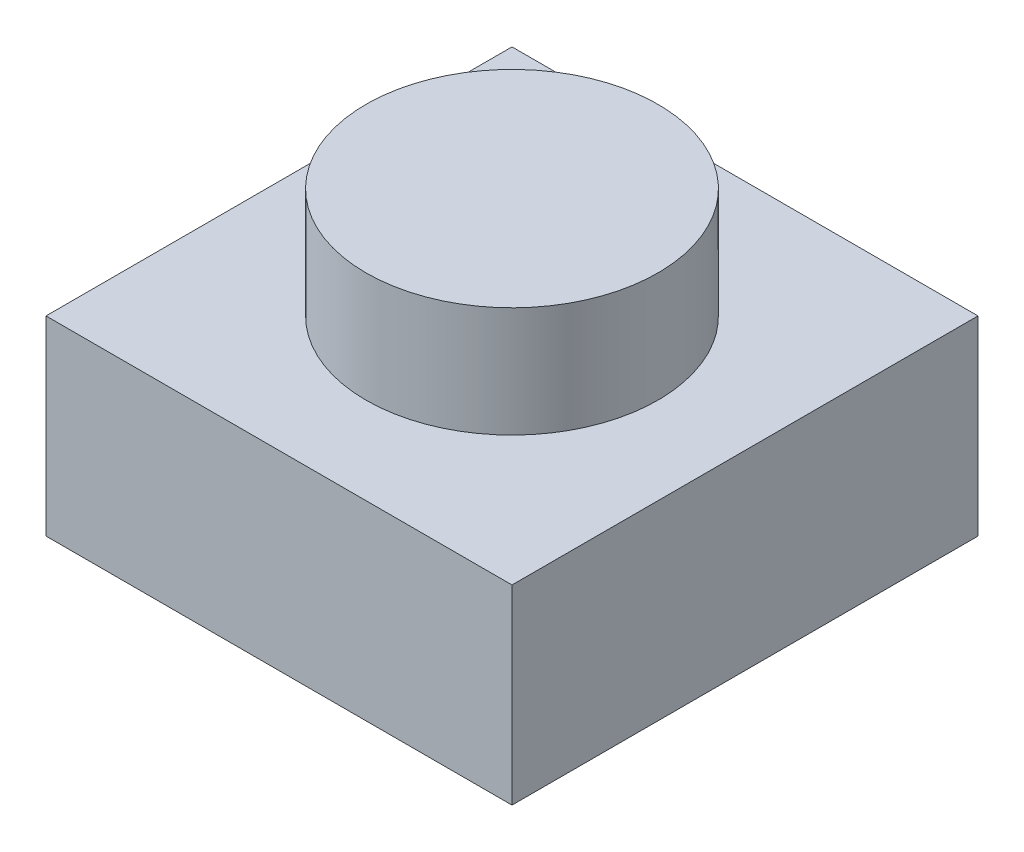
ISO-10303-21;
HEADER;
FILE_DESCRIPTION(('STEP AP214'),'2;1');
FILE_NAME('part.step','',(''),(''),'','','');
FILE_SCHEMA(('AUTOMOTIVE_DESIGN { 1 0 10303 214 1 1 1 1 }'));
ENDSEC;
DATA;
#1=APPLICATION_CONTEXT('core data for automotive mechanical design processes');
#2=APPLICATION_PROTOCOL_DEFINITION('international standard','automotive_design',2000,#1);
#3=PRODUCT_CONTEXT('',#1,'mechanical');
#4=PRODUCT('Part','Part','',(#3));
#5=PRODUCT_RELATED_PRODUCT_CATEGORY('part','',(#4));
#6=PRODUCT_DEFINITION_FORMATION('','',#4);
#7=PRODUCT_DEFINITION_CONTEXT('part definition',#1,'design');
#8=PRODUCT_DEFINITION('design','',#6,#7);
#9=PRODUCT_DEFINITION_SHAPE('','',#8);
#10=(LENGTH_UNIT() NAMED_UNIT(*) SI_UNIT(.MILLI.,.METRE.));
#11=(NAMED_UNIT(*) PLANE_ANGLE_UNIT() SI_UNIT($,.RADIAN.));
#12=(NAMED_UNIT(*) SI_UNIT($,.STERADIAN.) SOLID_ANGLE_UNIT());
#13=UNCERTAINTY_MEASURE_WITH_UNIT(LENGTH_MEASURE(1.E-05),#10,'distance_accuracy_value','');
#14=(GEOMETRIC_REPRESENTATION_CONTEXT(3) GLOBAL_UNCERTAINTY_ASSIGNED_CONTEXT((#13)) GLOBAL_UNIT_ASSIGNED_CONTEXT((#10,
#11,#12)) REPRESENTATION_CONTEXT('',''));
#15=CARTESIAN_POINT('',(0.,0.,0.));
#16=DIRECTION('',(0.,0.,1.));
#17=DIRECTION('',(1.,0.,0.));
#18=AXIS2_PLACEMENT_3D('',#15,#16,#17);
#19=CARTESIAN_POINT('',(3.91,-3.2,-3.91));
#20=DIRECTION('',(1.,0.,0.));
#21=DIRECTION('',(0.,0.,-1.));
#22=AXIS2_PLACEMENT_3D('',#19,#20,#21);
#23=PLANE('',#22);
#24=DIRECTION('',(0.,0.,-1.));
#25=VECTOR('',#24,1.);
#26=CARTESIAN_POINT('',(3.91,0.,-3.91));
#27=LINE('',#26,#25);
#28=CARTESIAN_POINT('',(3.91,0.,3.91));
#29=VERTEX_POINT('',#28);
#30=CARTESIAN_POINT('',(3.91,0.,-3.91));
#31=VERTEX_POINT('',#30);
#32=EDGE_CURVE('E160',#29,#31,#27,.T.);
#33=ORIENTED_EDGE('',*,*,#32,.F.);
#34=DIRECTION('',(0.,1.,0.));
#35=VECTOR('',#34,1.);
#36=CARTESIAN_POINT('',(3.91,-3.2,3.91));
#37=LINE('',#36,#35);
#38=CARTESIAN_POINT('',(3.91,-3.2,3.91));
#39=VERTEX_POINT('',#38);
#40=EDGE_CURVE('E47',#39,#29,#37,.T.);
#41=ORIENTED_EDGE('',*,*,#40,.F.);
#42=DIRECTION('',(0.,0.,-1.));
#43=VECTOR('',#42,1.);
#44=CARTESIAN_POINT('',(3.91,-3.2,-3.91));
#45=LINE('',#44,#43);
#46=CARTESIAN_POINT('',(3.91,-3.2,-3.91));
#47=VERTEX_POINT('',#46);
#48=EDGE_CURVE('E162',#39,#47,#45,.T.);
#49=ORIENTED_EDGE('',*,*,#48,.T.);
#50=DIRECTION('',(0.,1.,0.));
#51=VECTOR('',#50,1.);
#52=CARTESIAN_POINT('',(3.91,-3.2,-3.91));
#53=LINE('',#52,#51);
#54=EDGE_CURVE('E42',#47,#31,#53,.T.);
#55=ORIENTED_EDGE('',*,*,#54,.T.);
#56=EDGE_LOOP('',(#33,#41,#49,#55));
#57=FACE_BOUND('',#56,.T.);
#58=ADVANCED_FACE('F39',(#57),#23,.T.);
#59=CARTESIAN_POINT('',(-3.91,-3.2,3.91));
#60=DIRECTION('',(0.,0.,1.));
#61=DIRECTION('',(1.,0.,0.));
#62=AXIS2_PLACEMENT_3D('',#59,#60,#61);
#63=PLANE('',#62);
#64=DIRECTION('',(1.,0.,0.));
#65=VECTOR('',#64,1.);
#66=CARTESIAN_POINT('',(-3.91,0.,3.91));
#67=LINE('',#66,#65);
#68=CARTESIAN_POINT('',(-3.91,0.,3.91));
#69=VERTEX_POINT('',#68);
#70=EDGE_CURVE('E165',#69,#29,#67,.T.);
#71=ORIENTED_EDGE('',*,*,#70,.F.);
#72=DIRECTION('',(0.,1.,0.));
#73=VECTOR('',#72,1.);
#74=CARTESIAN_POINT('',(-3.91,-3.2,3.91));
#75=LINE('',#74,#73);
#76=CARTESIAN_POINT('',(-3.91,-3.2,3.91));
#77=VERTEX_POINT('',#76);
#78=EDGE_CURVE('E183',#77,#69,#75,.T.);
#79=ORIENTED_EDGE('',*,*,#78,.F.);
#80=DIRECTION('',(1.,0.,0.));
#81=VECTOR('',#80,1.);
#82=CARTESIAN_POINT('',(-3.91,-3.2,3.91));
#83=LINE('',#82,#81);
#84=EDGE_CURVE('E170',#77,#39,#83,.T.);
#85=ORIENTED_EDGE('',*,*,#84,.T.);
#86=ORIENTED_EDGE('',*,*,#40,.T.);
#87=EDGE_LOOP('',(#71,#79,#85,#86));
#88=FACE_BOUND('',#87,.T.);
#89=ADVANCED_FACE('F189',(#88),#63,.T.);
#90=CARTESIAN_POINT('',(-3.91,-3.2,-3.91));
#91=DIRECTION('',(-1.,0.,0.));
#92=DIRECTION('',(0.,0.,1.));
#93=AXIS2_PLACEMENT_3D('',#90,#91,#92);
#94=PLANE('',#93);
#95=DIRECTION('',(0.,0.,1.));
#96=VECTOR('',#95,1.);
#97=CARTESIAN_POINT('',(-3.91,0.,-3.91));
#98=LINE('',#97,#96);
#99=CARTESIAN_POINT('',(-3.91,0.,-3.91));
#100=VERTEX_POINT('',#99);
#101=EDGE_CURVE('E177',#100,#69,#98,.T.);
#102=ORIENTED_EDGE('',*,*,#101,.F.);
#103=DIRECTION('',(0.,1.,0.));
#104=VECTOR('',#103,1.);
#105=CARTESIAN_POINT('',(-3.91,-3.2,-3.91));
#106=LINE('',#105,#104);
#107=CARTESIAN_POINT('',(-3.91,-3.2,-3.91));
#108=VERTEX_POINT('',#107);
#109=EDGE_CURVE('E184',#108,#100,#106,.T.);
#110=ORIENTED_EDGE('',*,*,#109,.F.);
#111=DIRECTION('',(0.,0.,1.));
#112=VECTOR('',#111,1.);
#113=CARTESIAN_POINT('',(-3.91,-3.2,-3.91));
#114=LINE('',#113,#112);
#115=EDGE_CURVE('E167',#108,#77,#114,.T.);
#116=ORIENTED_EDGE('',*,*,#115,.T.);
#117=ORIENTED_EDGE('',*,*,#78,.T.);
#118=EDGE_LOOP('',(#102,#110,#116,#117));
#119=FACE_BOUND('',#118,.T.);
#120=ADVANCED_FACE('F193',(#119),#94,.T.);
#121=CARTESIAN_POINT('',(-3.91,-3.2,-3.91));
#122=DIRECTION('',(0.,0.,-1.));
#123=DIRECTION('',(-1.,0.,0.));
#124=AXIS2_PLACEMENT_3D('',#121,#122,#123);
#125=PLANE('',#124);
#126=DIRECTION('',(-1.,0.,0.));
#127=VECTOR('',#126,1.);
#128=CARTESIAN_POINT('',(-3.91,0.,-3.91));
#129=LINE('',#128,#127);
#130=EDGE_CURVE('E174',#31,#100,#129,.T.);
#131=ORIENTED_EDGE('',*,*,#130,.F.);
#132=ORIENTED_EDGE('',*,*,#54,.F.);
#133=DIRECTION('',(-1.,0.,0.));
#134=VECTOR('',#133,1.);
#135=CARTESIAN_POINT('',(-3.91,-3.2,-3.91));
#136=LINE('',#135,#134);
#137=EDGE_CURVE('E164',#47,#108,#136,.T.);
#138=ORIENTED_EDGE('',*,*,#137,.T.);
#139=ORIENTED_EDGE('',*,*,#109,.T.);
#140=EDGE_LOOP('',(#131,#132,#138,#139));
#141=FACE_BOUND('',#140,.T.);
#142=ADVANCED_FACE('F186',(#141),#125,.T.);
#143=CARTESIAN_POINT('',(0.,-3.2,0.));
#144=DIRECTION('',(0.,1.,0.));
#145=DIRECTION('',(0.,0.,1.));
#146=AXIS2_PLACEMENT_3D('',#143,#144,#145);
#147=PLANE('',#146);
#148=DIRECTION('',(1.,0.,0.));
#149=VECTOR('',#148,1.);
#150=CARTESIAN_POINT('',(0.,-3.2,2.4));
#151=LINE('',#150,#149);
#152=CARTESIAN_POINT('',(-2.4,-3.2,2.4));
#153=VERTEX_POINT('',#152);
#154=CARTESIAN_POINT('',(2.4,-3.2,2.4));
#155=VERTEX_POINT('',#154);
#156=EDGE_CURVE('E154',#153,#155,#151,.T.);
#157=ORIENTED_EDGE('',*,*,#156,.T.);
#158=DIRECTION('',(0.,0.,-1.));
#159=VECTOR('',#158,1.);
#160=CARTESIAN_POINT('',(2.4,-3.2,0.));
#161=LINE('',#160,#159);
#162=CARTESIAN_POINT('',(2.4,-3.2,-2.4));
#163=VERTEX_POINT('',#162);
#164=EDGE_CURVE('E117',#155,#163,#161,.T.);
#165=ORIENTED_EDGE('',*,*,#164,.T.);
#166=DIRECTION('',(-1.,0.,0.));
#167=VECTOR('',#166,1.);
#168=CARTESIAN_POINT('',(0.,-3.2,-2.4));
#169=LINE('',#168,#167);
#170=CARTESIAN_POINT('',(-2.4,-3.2,-2.4));
#171=VERTEX_POINT('',#170);
#172=EDGE_CURVE('E139',#163,#171,#169,.T.);
#173=ORIENTED_EDGE('',*,*,#172,.T.);
#174=DIRECTION('',(0.,0.,1.));
#175=VECTOR('',#174,1.);
#176=CARTESIAN_POINT('',(-2.4,-3.2,0.));
#177=LINE('',#176,#175);
#178=EDGE_CURVE('E55',#171,#153,#177,.T.);
#179=ORIENTED_EDGE('',*,*,#178,.T.);
#180=EDGE_LOOP('',(#157,#165,#173,#179));
#181=FACE_BOUND('',#180,.T.);
#182=ORIENTED_EDGE('',*,*,#48,.F.);
#183=ORIENTED_EDGE('',*,*,#84,.F.);
#184=ORIENTED_EDGE('',*,*,#115,.F.);
#185=ORIENTED_EDGE('',*,*,#137,.F.);
#186=EDGE_LOOP('',(#182,#183,#184,#185));
#187=FACE_BOUND('',#186,.T.);
#188=ADVANCED_FACE('F195',(#181,#187),#147,.F.);
#189=CARTESIAN_POINT('',(0.,0.,0.));
#190=DIRECTION('',(0.,1.,0.));
#191=DIRECTION('',(0.,0.,1.));
#192=AXIS2_PLACEMENT_3D('',#189,#190,#191);
#193=PLANE('',#192);
#194=CARTESIAN_POINT('',(0.,0.,0.));
#195=DIRECTION('',(0.,1.,0.));
#196=DIRECTION('',(0.,0.,1.));
#197=AXIS2_PLACEMENT_3D('',#194,#195,#196);
#198=CIRCLE('',#197,2.45);
#199=CARTESIAN_POINT('',(0.,0.,2.45));
#200=VERTEX_POINT('',#199);
#201=EDGE_CURVE('E11',#200,#200,#198,.T.);
#202=ORIENTED_EDGE('',*,*,#201,.F.);
#203=EDGE_LOOP('',(#202));
#204=FACE_BOUND('',#203,.T.);
#205=ORIENTED_EDGE('',*,*,#32,.T.);
#206=ORIENTED_EDGE('',*,*,#130,.T.);
#207=ORIENTED_EDGE('',*,*,#101,.T.);
#208=ORIENTED_EDGE('',*,*,#70,.T.);
#209=EDGE_LOOP('',(#205,#206,#207,#208));
#210=FACE_BOUND('',#209,.T.);
#211=ADVANCED_FACE('F188',(#204,#210),#193,.T.);
#212=CARTESIAN_POINT('',(0.,1.85,0.));
#213=DIRECTION('',(0.,-1.,0.));
#214=DIRECTION('',(0.,0.,-1.));
#215=AXIS2_PLACEMENT_3D('',#212,#213,#214);
#216=CYLINDRICAL_SURFACE('',#215,2.45);
#217=CARTESIAN_POINT('',(0.,1.85,0.));
#218=DIRECTION('',(0.,1.,0.));
#219=DIRECTION('',(0.,0.,1.));
#220=AXIS2_PLACEMENT_3D('',#217,#218,#219);
#221=CIRCLE('',#220,2.45);
#222=CARTESIAN_POINT('',(0.,1.85,2.45));
#223=VERTEX_POINT('',#222);
#224=EDGE_CURVE('E151',#223,#223,#221,.T.);
#225=ORIENTED_EDGE('',*,*,#224,.F.);
#226=EDGE_LOOP('',(#225));
#227=FACE_BOUND('',#226,.T.);
#228=ORIENTED_EDGE('',*,*,#201,.T.);
#229=EDGE_LOOP('',(#228));
#230=FACE_BOUND('',#229,.T.);
#231=ADVANCED_FACE('F203',(#227,#230),#216,.T.);
#232=CARTESIAN_POINT('',(0.,1.85,0.));
#233=DIRECTION('',(0.,1.,0.));
#234=DIRECTION('',(0.,0.,1.));
#235=AXIS2_PLACEMENT_3D('',#232,#233,#234);
#236=PLANE('',#235);
#237=ORIENTED_EDGE('',*,*,#224,.T.);
#238=EDGE_LOOP('',(#237));
#239=FACE_BOUND('',#238,.T.);
#240=ADVANCED_FACE('F238',(#239),#236,.T.);
#241=CARTESIAN_POINT('',(2.4,-3.2,-3.91));
#242=DIRECTION('',(1.,0.,0.));
#243=DIRECTION('',(0.,0.,-1.));
#244=AXIS2_PLACEMENT_3D('',#241,#242,#243);
#245=PLANE('',#244);
#246=DIRECTION('',(0.,0.,-1.));
#247=VECTOR('',#246,1.);
#248=CARTESIAN_POINT('',(2.4,-1.51,0.));
#249=LINE('',#248,#247);
#250=CARTESIAN_POINT('',(2.4,-1.51,2.4));
#251=VERTEX_POINT('',#250);
#252=CARTESIAN_POINT('',(2.4,-1.51,-2.4));
#253=VERTEX_POINT('',#252);
#254=EDGE_CURVE('E115',#251,#253,#249,.T.);
#255=ORIENTED_EDGE('',*,*,#254,.T.);
#256=DIRECTION('',(0.,1.,0.));
#257=VECTOR('',#256,1.);
#258=CARTESIAN_POINT('',(2.4,-3.2,-2.4));
#259=LINE('',#258,#257);
#260=EDGE_CURVE('E144',#163,#253,#259,.T.);
#261=ORIENTED_EDGE('',*,*,#260,.F.);
#262=ORIENTED_EDGE('',*,*,#164,.F.);
#263=DIRECTION('',(0.,1.,0.));
#264=VECTOR('',#263,1.);
#265=CARTESIAN_POINT('',(2.4,-3.2,2.4));
#266=LINE('',#265,#264);
#267=EDGE_CURVE('E112',#155,#251,#266,.T.);
#268=ORIENTED_EDGE('',*,*,#267,.T.);
#269=EDGE_LOOP('',(#255,#261,#262,#268));
#270=FACE_BOUND('',#269,.T.);
#271=ADVANCED_FACE('F114',(#270),#245,.F.);
#272=CARTESIAN_POINT('',(-3.91,-3.2,2.4));
#273=DIRECTION('',(0.,0.,1.));
#274=DIRECTION('',(1.,0.,0.));
#275=AXIS2_PLACEMENT_3D('',#272,#273,#274);
#276=PLANE('',#275);
#277=DIRECTION('',(1.,0.,0.));
#278=VECTOR('',#277,1.);
#279=CARTESIAN_POINT('',(0.,-1.51,2.4));
#280=LINE('',#279,#278);
#281=CARTESIAN_POINT('',(-2.4,-1.51,2.4));
#282=VERTEX_POINT('',#281);
#283=EDGE_CURVE('E130',#282,#251,#280,.T.);
#284=ORIENTED_EDGE('',*,*,#283,.T.);
#285=ORIENTED_EDGE('',*,*,#267,.F.);
#286=ORIENTED_EDGE('',*,*,#156,.F.);
#287=DIRECTION('',(0.,1.,0.));
#288=VECTOR('',#287,1.);
#289=CARTESIAN_POINT('',(-2.4,-3.2,2.4));
#290=LINE('',#289,#288);
#291=EDGE_CURVE('E123',#153,#282,#290,.T.);
#292=ORIENTED_EDGE('',*,*,#291,.T.);
#293=EDGE_LOOP('',(#284,#285,#286,#292));
#294=FACE_BOUND('',#293,.T.);
#295=ADVANCED_FACE('F135',(#294),#276,.F.);
#296=CARTESIAN_POINT('',(-2.4,-3.2,-3.91));
#297=DIRECTION('',(-1.,0.,0.));
#298=DIRECTION('',(0.,0.,1.));
#299=AXIS2_PLACEMENT_3D('',#296,#297,#298);
#300=PLANE('',#299);
#301=DIRECTION('',(0.,0.,1.));
#302=VECTOR('',#301,1.);
#303=CARTESIAN_POINT('',(-2.4,-1.51,0.));
#304=LINE('',#303,#302);
#305=CARTESIAN_POINT('',(-2.4,-1.51,-2.4));
#306=VERTEX_POINT('',#305);
#307=EDGE_CURVE('E137',#306,#282,#304,.T.);
#308=ORIENTED_EDGE('',*,*,#307,.T.);
#309=ORIENTED_EDGE('',*,*,#291,.F.);
#310=ORIENTED_EDGE('',*,*,#178,.F.);
#311=DIRECTION('',(0.,1.,0.));
#312=VECTOR('',#311,1.);
#313=CARTESIAN_POINT('',(-2.4,-3.2,-2.4));
#314=LINE('',#313,#312);
#315=EDGE_CURVE('E145',#171,#306,#314,.T.);
#316=ORIENTED_EDGE('',*,*,#315,.T.);
#317=EDGE_LOOP('',(#308,#309,#310,#316));
#318=FACE_BOUND('',#317,.T.);
#319=ADVANCED_FACE('F267',(#318),#300,.F.);
#320=CARTESIAN_POINT('',(-3.91,-3.2,-2.4));
#321=DIRECTION('',(0.,0.,-1.));
#322=DIRECTION('',(-1.,0.,0.));
#323=AXIS2_PLACEMENT_3D('',#320,#321,#322);
#324=PLANE('',#323);
#325=DIRECTION('',(-1.,0.,0.));
#326=VECTOR('',#325,1.);
#327=CARTESIAN_POINT('',(0.,-1.51,-2.4));
#328=LINE('',#327,#326);
#329=EDGE_CURVE('E132',#253,#306,#328,.T.);
#330=ORIENTED_EDGE('',*,*,#329,.T.);
#331=ORIENTED_EDGE('',*,*,#315,.F.);
#332=ORIENTED_EDGE('',*,*,#172,.F.);
#333=ORIENTED_EDGE('',*,*,#260,.T.);
#334=EDGE_LOOP('',(#330,#331,#332,#333));
#335=FACE_BOUND('',#334,.T.);
#336=ADVANCED_FACE('F276',(#335),#324,.F.);
#337=CARTESIAN_POINT('',(0.,-1.51,0.));
#338=DIRECTION('',(0.,1.,0.));
#339=DIRECTION('',(0.,0.,1.));
#340=AXIS2_PLACEMENT_3D('',#337,#338,#339);
#341=PLANE('',#340);
#342=CARTESIAN_POINT('',(0.,-1.51,0.));
#343=DIRECTION('',(0.,1.,0.));
#344=DIRECTION('',(0.,0.,1.));
#345=AXIS2_PLACEMENT_3D('',#342,#343,#344);
#346=CIRCLE('',#345,0.940000000000001);
#347=CARTESIAN_POINT('',(0.,-1.51,0.940000000000001));
#348=VERTEX_POINT('',#347);
#349=EDGE_CURVE('E122',#348,#348,#346,.T.);
#350=ORIENTED_EDGE('',*,*,#349,.T.);
#351=EDGE_LOOP('',(#350));
#352=FACE_BOUND('',#351,.T.);
#353=ORIENTED_EDGE('',*,*,#254,.F.);
#354=ORIENTED_EDGE('',*,*,#283,.F.);
#355=ORIENTED_EDGE('',*,*,#307,.F.);
#356=ORIENTED_EDGE('',*,*,#329,.F.);
#357=EDGE_LOOP('',(#353,#354,#355,#356));
#358=FACE_BOUND('',#357,.T.);
#359=ADVANCED_FACE('F128',(#352,#358),#341,.F.);
#360=CARTESIAN_POINT('',(0.,1.85,0.));
#361=DIRECTION('',(0.,-1.,0.));
#362=DIRECTION('',(0.,0.,-1.));
#363=AXIS2_PLACEMENT_3D('',#360,#361,#362);
#364=CYLINDRICAL_SURFACE('',#363,0.940000000000001);
#365=CARTESIAN_POINT('',(0.,0.34,0.));
#366=DIRECTION('',(0.,1.,0.));
#367=DIRECTION('',(0.,0.,1.));
#368=AXIS2_PLACEMENT_3D('',#365,#366,#367);
#369=CIRCLE('',#368,0.940000000000001);
#370=CARTESIAN_POINT('',(0.,0.34,0.940000000000001));
#371=VERTEX_POINT('',#370);
#372=EDGE_CURVE('E133',#371,#371,#369,.T.);
#373=ORIENTED_EDGE('',*,*,#372,.T.);
#374=EDGE_LOOP('',(#373));
#375=FACE_BOUND('',#374,.T.);
#376=ORIENTED_EDGE('',*,*,#349,.F.);
#377=EDGE_LOOP('',(#376));
#378=FACE_BOUND('',#377,.T.);
#379=ADVANCED_FACE('F295',(#375,#378),#364,.F.);
#380=CARTESIAN_POINT('',(0.,0.34,0.));
#381=DIRECTION('',(0.,1.,0.));
#382=DIRECTION('',(0.,0.,1.));
#383=AXIS2_PLACEMENT_3D('',#380,#381,#382);
#384=PLANE('',#383);
#385=ORIENTED_EDGE('',*,*,#372,.F.);
#386=EDGE_LOOP('',(#385));
#387=FACE_BOUND('',#386,.T.);
#388=ADVANCED_FACE('F307',(#387),#384,.F.);
#389=CLOSED_SHELL('',(#58,#89,#120,#142,#188,#211,#231,#240,#271,#295,#319,#336,#359,#379,#388));
#390=MANIFOLD_SOLID_BREP('B2',#389);
#391=ADVANCED_BREP_SHAPE_REPRESENTATION('',(#18,#390),#14);
#392=SHAPE_DEFINITION_REPRESENTATION(#9,#391);
ENDSEC;
END-ISO-10303-21;
